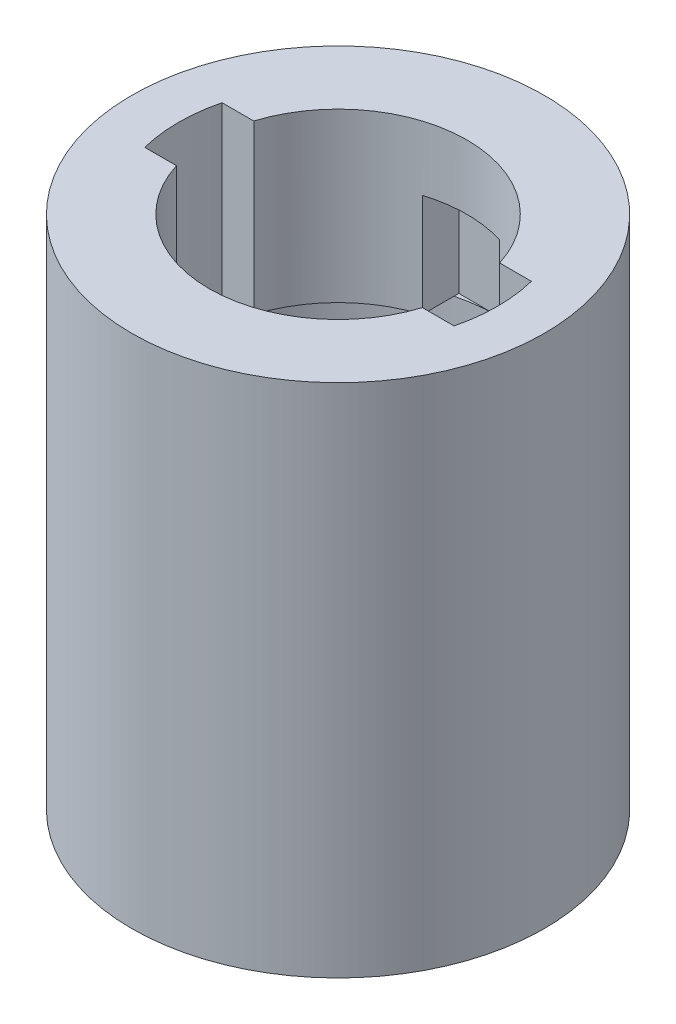
ISO-10303-21;
HEADER;
FILE_DESCRIPTION(('STEP AP214'),'2;1');
FILE_NAME('part.step','',(''),(''),'','','');
FILE_SCHEMA(('AUTOMOTIVE_DESIGN { 1 0 10303 214 1 1 1 1 }'));
ENDSEC;
DATA;
#1=APPLICATION_CONTEXT('core data for automotive mechanical design processes');
#2=APPLICATION_PROTOCOL_DEFINITION('international standard','automotive_design',2000,#1);
#3=PRODUCT_CONTEXT('',#1,'mechanical');
#4=PRODUCT('Part','Part','',(#3));
#5=PRODUCT_RELATED_PRODUCT_CATEGORY('part','',(#4));
#6=PRODUCT_DEFINITION_FORMATION('','',#4);
#7=PRODUCT_DEFINITION_CONTEXT('part definition',#1,'design');
#8=PRODUCT_DEFINITION('design','',#6,#7);
#9=PRODUCT_DEFINITION_SHAPE('','',#8);
#10=(LENGTH_UNIT() NAMED_UNIT(*) SI_UNIT(.MILLI.,.METRE.));
#11=(NAMED_UNIT(*) PLANE_ANGLE_UNIT() SI_UNIT($,.RADIAN.));
#12=(NAMED_UNIT(*) SI_UNIT($,.STERADIAN.) SOLID_ANGLE_UNIT());
#13=UNCERTAINTY_MEASURE_WITH_UNIT(LENGTH_MEASURE(1.E-05),#10,'distance_accuracy_value','');
#14=(GEOMETRIC_REPRESENTATION_CONTEXT(3) GLOBAL_UNCERTAINTY_ASSIGNED_CONTEXT((#13)) GLOBAL_UNIT_ASSIGNED_CONTEXT((#10,
#11,#12)) REPRESENTATION_CONTEXT('',''));
#15=CARTESIAN_POINT('',(0.,0.,0.));
#16=DIRECTION('',(0.,0.,1.));
#17=DIRECTION('',(1.,0.,0.));
#18=AXIS2_PLACEMENT_3D('',#15,#16,#17);
#19=CARTESIAN_POINT('',(6.,13.5,0.));
#20=DIRECTION('',(0.,1.,0.));
#21=DIRECTION('',(0.,0.,1.));
#22=AXIS2_PLACEMENT_3D('',#19,#20,#21);
#23=PLANE('',#22);
#24=CARTESIAN_POINT('',(0.,13.5,0.));
#25=DIRECTION('',(0.,1.,0.));
#26=DIRECTION('',(0.,0.,1.));
#27=AXIS2_PLACEMENT_3D('',#24,#25,#26);
#28=CIRCLE('',#27,5.);
#29=CARTESIAN_POINT('',(-4.76969600708473,13.5,1.5));
#30=VERTEX_POINT('',#29);
#31=CARTESIAN_POINT('',(-1.5,13.5,4.76969600708473));
#32=VERTEX_POINT('',#31);
#33=EDGE_CURVE('E233',#30,#32,#28,.T.);
#34=ORIENTED_EDGE('',*,*,#33,.T.);
#35=DIRECTION('',(0.,0.,-1.));
#36=VECTOR('',#35,1.);
#37=CARTESIAN_POINT('',(-1.5,13.5,-6.));
#38=LINE('',#37,#36);
#39=CARTESIAN_POINT('',(-1.5,13.5,6.));
#40=VERTEX_POINT('',#39);
#41=EDGE_CURVE('E209',#40,#32,#38,.T.);
#42=ORIENTED_EDGE('',*,*,#41,.F.);
#43=CARTESIAN_POINT('',(0.,13.5,0.));
#44=DIRECTION('',(0.,-1.,0.));
#45=DIRECTION('',(0.,0.,-1.));
#46=AXIS2_PLACEMENT_3D('',#43,#44,#45);
#47=CIRCLE('',#46,6.18465843842649);
#48=CARTESIAN_POINT('',(-6.,13.5,1.5));
#49=VERTEX_POINT('',#48);
#50=EDGE_CURVE('E230',#40,#49,#47,.T.);
#51=ORIENTED_EDGE('',*,*,#50,.T.);
#52=DIRECTION('',(-1.,0.,0.));
#53=VECTOR('',#52,1.);
#54=CARTESIAN_POINT('',(-6.,13.5,1.5));
#55=LINE('',#54,#53);
#56=EDGE_CURVE('E236',#30,#49,#55,.T.);
#57=ORIENTED_EDGE('',*,*,#56,.F.);
#58=EDGE_LOOP('',(#34,#42,#51,#57));
#59=FACE_BOUND('',#58,.T.);
#60=ADVANCED_FACE('F31',(#59),#23,.F.);
#61=CARTESIAN_POINT('',(-6.,13.5,-1.5));
#62=VERTEX_POINT('',#61);
#63=CARTESIAN_POINT('',(-1.5,13.5,-6.));
#64=VERTEX_POINT('',#63);
#65=EDGE_CURVE('E227',#62,#64,#47,.T.);
#66=ORIENTED_EDGE('',*,*,#65,.T.);
#67=DIRECTION('',(0.,0.,1.));
#68=VECTOR('',#67,1.);
#69=CARTESIAN_POINT('',(-1.5,13.5,0.));
#70=LINE('',#69,#68);
#71=CARTESIAN_POINT('',(-1.5,13.5,-4.76969600708473));
#72=VERTEX_POINT('',#71);
#73=EDGE_CURVE('E39',#64,#72,#70,.T.);
#74=ORIENTED_EDGE('',*,*,#73,.T.);
#75=CARTESIAN_POINT('',(-4.76969600708473,13.5,-1.5));
#76=VERTEX_POINT('',#75);
#77=EDGE_CURVE('E244',#72,#76,#28,.T.);
#78=ORIENTED_EDGE('',*,*,#77,.T.);
#79=DIRECTION('',(1.,0.,0.));
#80=VECTOR('',#79,1.);
#81=CARTESIAN_POINT('',(-6.,13.5,-1.5));
#82=LINE('',#81,#80);
#83=EDGE_CURVE('E245',#62,#76,#82,.T.);
#84=ORIENTED_EDGE('',*,*,#83,.F.);
#85=EDGE_LOOP('',(#66,#74,#78,#84));
#86=FACE_BOUND('',#85,.T.);
#87=ADVANCED_FACE('F305',(#86),#23,.F.);
#88=CARTESIAN_POINT('',(0.,20.,0.));
#89=DIRECTION('',(0.,-1.,0.));
#90=DIRECTION('',(0.,0.,-1.));
#91=AXIS2_PLACEMENT_3D('',#88,#89,#90);
#92=CYLINDRICAL_SURFACE('',#91,5.);
#93=DIRECTION('',(0.,-1.,0.));
#94=VECTOR('',#93,1.);
#95=CARTESIAN_POINT('',(-1.5,20.,4.76969600708473));
#96=LINE('',#95,#94);
#97=CARTESIAN_POINT('',(-1.50000000000005,17.5,4.76969600708471));
#98=VERTEX_POINT('',#97);
#99=EDGE_CURVE('E222',#32,#98,#96,.F.);
#100=ORIENTED_EDGE('',*,*,#99,.F.);
#101=ORIENTED_EDGE('',*,*,#33,.F.);
#102=DIRECTION('',(0.,-1.,0.));
#103=VECTOR('',#102,1.);
#104=CARTESIAN_POINT('',(-4.76969600708473,20.,1.5));
#105=LINE('',#104,#103);
#106=CARTESIAN_POINT('',(-4.76969600708473,20.,1.5));
#107=VERTEX_POINT('',#106);
#108=EDGE_CURVE('E287',#107,#30,#105,.T.);
#109=ORIENTED_EDGE('',*,*,#108,.F.);
#110=CARTESIAN_POINT('',(0.,20.,0.));
#111=DIRECTION('',(0.,1.,0.));
#112=DIRECTION('',(0.,0.,1.));
#113=AXIS2_PLACEMENT_3D('',#110,#111,#112);
#114=CIRCLE('',#113,5.);
#115=CARTESIAN_POINT('',(4.76969600708473,20.,1.5));
#116=VERTEX_POINT('',#115);
#117=EDGE_CURVE('E272',#107,#116,#114,.T.);
#118=ORIENTED_EDGE('',*,*,#117,.T.);
#119=DIRECTION('',(0.,-1.,0.));
#120=VECTOR('',#119,1.);
#121=CARTESIAN_POINT('',(4.76969600708473,20.,1.5));
#122=LINE('',#121,#120);
#123=CARTESIAN_POINT('',(4.76969600708473,13.5,1.5));
#124=VERTEX_POINT('',#123);
#125=EDGE_CURVE('E292',#124,#116,#122,.F.);
#126=ORIENTED_EDGE('',*,*,#125,.F.);
#127=CARTESIAN_POINT('',(1.5,13.5,4.76969600708473));
#128=VERTEX_POINT('',#127);
#129=EDGE_CURVE('E237',#128,#124,#28,.T.);
#130=ORIENTED_EDGE('',*,*,#129,.F.);
#131=DIRECTION('',(0.,-1.,0.));
#132=VECTOR('',#131,1.);
#133=CARTESIAN_POINT('',(1.5,20.,4.76969600708473));
#134=LINE('',#133,#132);
#135=CARTESIAN_POINT('',(1.49999999999995,17.5,4.76969600708475));
#136=VERTEX_POINT('',#135);
#137=EDGE_CURVE('E46',#136,#128,#134,.T.);
#138=ORIENTED_EDGE('',*,*,#137,.F.);
#139=CARTESIAN_POINT('',(0.,17.5,0.));
#140=DIRECTION('',(0.,1.,0.));
#141=DIRECTION('',(0.,0.,1.));
#142=AXIS2_PLACEMENT_3D('',#139,#140,#141);
#143=CIRCLE('',#142,5.);
#144=EDGE_CURVE('E224',#98,#136,#143,.T.);
#145=ORIENTED_EDGE('',*,*,#144,.F.);
#146=EDGE_LOOP('',(#100,#101,#109,#118,#126,#130,#138,#145));
#147=FACE_BOUND('',#146,.T.);
#148=ADVANCED_FACE('F371',(#147),#92,.F.);
#149=DIRECTION('',(0.,-1.,0.));
#150=VECTOR('',#149,1.);
#151=CARTESIAN_POINT('',(-1.5,20.,-4.76969600708473));
#152=LINE('',#151,#150);
#153=CARTESIAN_POINT('',(-1.50000000000001,17.5,-4.76969600708473));
#154=VERTEX_POINT('',#153);
#155=EDGE_CURVE('E220',#154,#72,#152,.T.);
#156=ORIENTED_EDGE('',*,*,#155,.F.);
#157=CARTESIAN_POINT('',(0.,17.5,0.));
#158=DIRECTION('',(0.,1.,0.));
#159=DIRECTION('',(0.,0.,1.));
#160=AXIS2_PLACEMENT_3D('',#157,#158,#159);
#161=CIRCLE('',#160,5.);
#162=CARTESIAN_POINT('',(1.49999999999999,17.5,-4.76969600708473));
#163=VERTEX_POINT('',#162);
#164=EDGE_CURVE('E11',#163,#154,#161,.T.);
#165=ORIENTED_EDGE('',*,*,#164,.F.);
#166=DIRECTION('',(0.,-1.,0.));
#167=VECTOR('',#166,1.);
#168=CARTESIAN_POINT('',(1.5,20.,-4.76969600708473));
#169=LINE('',#168,#167);
#170=CARTESIAN_POINT('',(1.5,13.5,-4.76969600708473));
#171=VERTEX_POINT('',#170);
#172=EDGE_CURVE('E213',#171,#163,#169,.F.);
#173=ORIENTED_EDGE('',*,*,#172,.F.);
#174=CARTESIAN_POINT('',(4.76969600708473,13.5,-1.5));
#175=VERTEX_POINT('',#174);
#176=EDGE_CURVE('E238',#175,#171,#28,.T.);
#177=ORIENTED_EDGE('',*,*,#176,.F.);
#178=DIRECTION('',(0.,-1.,0.));
#179=VECTOR('',#178,1.);
#180=CARTESIAN_POINT('',(4.76969600708473,20.,-1.5));
#181=LINE('',#180,#179);
#182=CARTESIAN_POINT('',(4.76969600708473,20.,-1.5));
#183=VERTEX_POINT('',#182);
#184=EDGE_CURVE('E294',#183,#175,#181,.T.);
#185=ORIENTED_EDGE('',*,*,#184,.F.);
#186=CARTESIAN_POINT('',(-4.76969600708473,20.,-1.5));
#187=VERTEX_POINT('',#186);
#188=EDGE_CURVE('E275',#183,#187,#114,.T.);
#189=ORIENTED_EDGE('',*,*,#188,.T.);
#190=DIRECTION('',(0.,-1.,0.));
#191=VECTOR('',#190,1.);
#192=CARTESIAN_POINT('',(-4.76969600708473,20.,-1.5));
#193=LINE('',#192,#191);
#194=EDGE_CURVE('E290',#76,#187,#193,.F.);
#195=ORIENTED_EDGE('',*,*,#194,.F.);
#196=ORIENTED_EDGE('',*,*,#77,.F.);
#197=EDGE_LOOP('',(#156,#165,#173,#177,#185,#189,#195,#196));
#198=FACE_BOUND('',#197,.T.);
#199=ADVANCED_FACE('F310',(#198),#92,.F.);
#200=CARTESIAN_POINT('',(0.,20.,0.));
#201=DIRECTION('',(0.,1.,0.));
#202=DIRECTION('',(0.,0.,1.));
#203=AXIS2_PLACEMENT_3D('',#200,#201,#202);
#204=PLANE('',#203);
#205=DIRECTION('',(-1.,0.,0.));
#206=VECTOR('',#205,1.);
#207=CARTESIAN_POINT('',(-6.,20.,-1.5));
#208=LINE('',#207,#206);
#209=CARTESIAN_POINT('',(-6.,20.,-1.5));
#210=VERTEX_POINT('',#209);
#211=EDGE_CURVE('E262',#187,#210,#208,.T.);
#212=ORIENTED_EDGE('',*,*,#211,.F.);
#213=ORIENTED_EDGE('',*,*,#188,.F.);
#214=CARTESIAN_POINT('',(6.,20.,-1.5));
#215=VERTEX_POINT('',#214);
#216=EDGE_CURVE('E253',#215,#183,#208,.T.);
#217=ORIENTED_EDGE('',*,*,#216,.F.);
#218=CARTESIAN_POINT('',(0.,20.,0.));
#219=DIRECTION('',(0.,1.,0.));
#220=DIRECTION('',(0.,0.,-1.));
#221=AXIS2_PLACEMENT_3D('',#218,#219,#220);
#222=CIRCLE('',#221,6.18465843842649);
#223=CARTESIAN_POINT('',(6.,20.,1.5));
#224=VERTEX_POINT('',#223);
#225=EDGE_CURVE('E259',#224,#215,#222,.T.);
#226=ORIENTED_EDGE('',*,*,#225,.F.);
#227=DIRECTION('',(1.,0.,0.));
#228=VECTOR('',#227,1.);
#229=CARTESIAN_POINT('',(-6.,20.,1.5));
#230=LINE('',#229,#228);
#231=EDGE_CURVE('E256',#116,#224,#230,.T.);
#232=ORIENTED_EDGE('',*,*,#231,.F.);
#233=ORIENTED_EDGE('',*,*,#117,.F.);
#234=CARTESIAN_POINT('',(-6.,20.,1.5));
#235=VERTEX_POINT('',#234);
#236=EDGE_CURVE('E257',#235,#107,#230,.T.);
#237=ORIENTED_EDGE('',*,*,#236,.F.);
#238=CARTESIAN_POINT('',(0.,20.,0.));
#239=DIRECTION('',(0.,1.,0.));
#240=DIRECTION('',(0.,0.,1.));
#241=AXIS2_PLACEMENT_3D('',#238,#239,#240);
#242=CIRCLE('',#241,6.18465843842649);
#243=EDGE_CURVE('E248',#210,#235,#242,.T.);
#244=ORIENTED_EDGE('',*,*,#243,.F.);
#245=EDGE_LOOP('',(#212,#213,#217,#226,#232,#233,#237,#244));
#246=FACE_BOUND('',#245,.T.);
#247=CARTESIAN_POINT('',(0.,20.,0.));
#248=DIRECTION('',(0.,1.,0.));
#249=DIRECTION('',(0.,0.,1.));
#250=AXIS2_PLACEMENT_3D('',#247,#248,#249);
#251=CIRCLE('',#250,8.);
#252=CARTESIAN_POINT('',(0.,20.,8.));
#253=VERTEX_POINT('',#252);
#254=EDGE_CURVE('E278',#253,#253,#251,.T.);
#255=ORIENTED_EDGE('',*,*,#254,.T.);
#256=EDGE_LOOP('',(#255));
#257=FACE_BOUND('',#256,.T.);
#258=ADVANCED_FACE('F344',(#246,#257),#204,.T.);
#259=CARTESIAN_POINT('',(0.,0.,0.));
#260=DIRECTION('',(0.,1.,0.));
#261=DIRECTION('',(0.,0.,1.));
#262=AXIS2_PLACEMENT_3D('',#259,#260,#261);
#263=PLANE('',#262);
#264=CARTESIAN_POINT('',(0.,0.,0.));
#265=DIRECTION('',(0.,1.,0.));
#266=DIRECTION('',(0.,0.,1.));
#267=AXIS2_PLACEMENT_3D('',#264,#265,#266);
#268=CIRCLE('',#267,8.);
#269=CARTESIAN_POINT('',(0.,0.,8.));
#270=VERTEX_POINT('',#269);
#271=EDGE_CURVE('E282',#270,#270,#268,.T.);
#272=ORIENTED_EDGE('',*,*,#271,.F.);
#273=EDGE_LOOP('',(#272));
#274=FACE_BOUND('',#273,.T.);
#275=CARTESIAN_POINT('',(0.,0.,0.));
#276=DIRECTION('',(0.,1.,0.));
#277=DIRECTION('',(0.,0.,1.));
#278=AXIS2_PLACEMENT_3D('',#275,#276,#277);
#279=CIRCLE('',#278,5.);
#280=CARTESIAN_POINT('',(0.,0.,5.));
#281=VERTEX_POINT('',#280);
#282=EDGE_CURVE('E266',#281,#281,#279,.T.);
#283=ORIENTED_EDGE('',*,*,#282,.T.);
#284=EDGE_LOOP('',(#283));
#285=FACE_BOUND('',#284,.T.);
#286=ADVANCED_FACE('F599',(#274,#285),#263,.F.);
#287=CARTESIAN_POINT('',(0.,20.,0.));
#288=DIRECTION('',(0.,-1.,0.));
#289=DIRECTION('',(0.,0.,-1.));
#290=AXIS2_PLACEMENT_3D('',#287,#288,#289);
#291=CYLINDRICAL_SURFACE('',#290,8.);
#292=ORIENTED_EDGE('',*,*,#254,.F.);
#293=EDGE_LOOP('',(#292));
#294=FACE_BOUND('',#293,.T.);
#295=ORIENTED_EDGE('',*,*,#271,.T.);
#296=EDGE_LOOP('',(#295));
#297=FACE_BOUND('',#296,.T.);
#298=ADVANCED_FACE('F33',(#294,#297),#291,.T.);
#299=CARTESIAN_POINT('',(0.,10.5,0.));
#300=DIRECTION('',(0.,1.,0.));
#301=DIRECTION('',(0.,0.,1.));
#302=AXIS2_PLACEMENT_3D('',#299,#300,#301);
#303=CIRCLE('',#302,5.);
#304=CARTESIAN_POINT('',(0.,10.5,5.));
#305=VERTEX_POINT('',#304);
#306=EDGE_CURVE('E281',#305,#305,#303,.T.);
#307=ORIENTED_EDGE('',*,*,#306,.T.);
#308=EDGE_LOOP('',(#307));
#309=FACE_BOUND('',#308,.T.);
#310=ORIENTED_EDGE('',*,*,#282,.F.);
#311=EDGE_LOOP('',(#310));
#312=FACE_BOUND('',#311,.T.);
#313=ADVANCED_FACE('F395',(#309,#312),#92,.F.);
#314=CARTESIAN_POINT('',(-6.,10.5,1.5));
#315=DIRECTION('',(0.,0.,1.));
#316=DIRECTION('',(1.,0.,0.));
#317=AXIS2_PLACEMENT_3D('',#314,#315,#316);
#318=PLANE('',#317);
#319=ORIENTED_EDGE('',*,*,#108,.T.);
#320=ORIENTED_EDGE('',*,*,#56,.T.);
#321=DIRECTION('',(0.,1.,0.));
#322=VECTOR('',#321,1.);
#323=CARTESIAN_POINT('',(-6.,10.5,1.5));
#324=LINE('',#323,#322);
#325=EDGE_CURVE('E252',#49,#235,#324,.T.);
#326=ORIENTED_EDGE('',*,*,#325,.T.);
#327=ORIENTED_EDGE('',*,*,#236,.T.);
#328=EDGE_LOOP('',(#319,#320,#326,#327));
#329=FACE_BOUND('',#328,.T.);
#330=ADVANCED_FACE('F386',(#329),#318,.F.);
#331=CARTESIAN_POINT('',(-6.,10.5,-1.5));
#332=DIRECTION('',(0.,0.,-1.));
#333=DIRECTION('',(-1.,0.,0.));
#334=AXIS2_PLACEMENT_3D('',#331,#332,#333);
#335=PLANE('',#334);
#336=DIRECTION('',(0.,1.,0.));
#337=VECTOR('',#336,1.);
#338=CARTESIAN_POINT('',(-6.,10.5,-1.5));
#339=LINE('',#338,#337);
#340=EDGE_CURVE('E264',#62,#210,#339,.T.);
#341=ORIENTED_EDGE('',*,*,#340,.F.);
#342=ORIENTED_EDGE('',*,*,#83,.T.);
#343=ORIENTED_EDGE('',*,*,#194,.T.);
#344=ORIENTED_EDGE('',*,*,#211,.T.);
#345=EDGE_LOOP('',(#341,#342,#343,#344));
#346=FACE_BOUND('',#345,.T.);
#347=ADVANCED_FACE('F394',(#346),#335,.F.);
#348=CARTESIAN_POINT('',(0.,10.5,0.));
#349=DIRECTION('',(0.,1.,0.));
#350=DIRECTION('',(0.,0.,1.));
#351=AXIS2_PLACEMENT_3D('',#348,#349,#350);
#352=CYLINDRICAL_SURFACE('',#351,6.18465843842649);
#353=ORIENTED_EDGE('',*,*,#325,.F.);
#354=ORIENTED_EDGE('',*,*,#50,.F.);
#355=CARTESIAN_POINT('',(0.,13.5,6.18465843842649));
#356=VERTEX_POINT('',#355);
#357=EDGE_CURVE('E318',#356,#40,#47,.T.);
#358=ORIENTED_EDGE('',*,*,#357,.F.);
#359=CARTESIAN_POINT('',(1.5,13.5,6.));
#360=VERTEX_POINT('',#359);
#361=EDGE_CURVE('E316',#360,#356,#47,.T.);
#362=ORIENTED_EDGE('',*,*,#361,.F.);
#363=CARTESIAN_POINT('',(6.,13.5,1.5));
#364=VERTEX_POINT('',#363);
#365=EDGE_CURVE('E232',#364,#360,#47,.T.);
#366=ORIENTED_EDGE('',*,*,#365,.F.);
#367=DIRECTION('',(0.,1.,0.));
#368=VECTOR('',#367,1.);
#369=CARTESIAN_POINT('',(6.,10.5,1.5));
#370=LINE('',#369,#368);
#371=EDGE_CURVE('E269',#364,#224,#370,.T.);
#372=ORIENTED_EDGE('',*,*,#371,.T.);
#373=ORIENTED_EDGE('',*,*,#225,.T.);
#374=DIRECTION('',(0.,1.,0.));
#375=VECTOR('',#374,1.);
#376=CARTESIAN_POINT('',(6.,10.5,-1.5));
#377=LINE('',#376,#375);
#378=CARTESIAN_POINT('',(6.,13.5,-1.5));
#379=VERTEX_POINT('',#378);
#380=EDGE_CURVE('E267',#379,#215,#377,.T.);
#381=ORIENTED_EDGE('',*,*,#380,.F.);
#382=CARTESIAN_POINT('',(1.5,13.5,-6.));
#383=VERTEX_POINT('',#382);
#384=EDGE_CURVE('E226',#383,#379,#47,.T.);
#385=ORIENTED_EDGE('',*,*,#384,.F.);
#386=CARTESIAN_POINT('',(0.,13.5,-6.18465843842649));
#387=VERTEX_POINT('',#386);
#388=EDGE_CURVE('E319',#387,#383,#47,.T.);
#389=ORIENTED_EDGE('',*,*,#388,.F.);
#390=EDGE_CURVE('E231',#64,#387,#47,.T.);
#391=ORIENTED_EDGE('',*,*,#390,.F.);
#392=ORIENTED_EDGE('',*,*,#65,.F.);
#393=ORIENTED_EDGE('',*,*,#340,.T.);
#394=ORIENTED_EDGE('',*,*,#243,.T.);
#395=EDGE_LOOP('',(#353,#354,#358,#362,#366,#372,#373,#381,#385,#389,#391,#392,#393,#394));
#396=FACE_BOUND('',#395,.T.);
#397=CARTESIAN_POINT('',(0.,10.5,0.));
#398=DIRECTION('',(0.,1.,0.));
#399=DIRECTION('',(0.,0.,1.));
#400=AXIS2_PLACEMENT_3D('',#397,#398,#399);
#401=CIRCLE('',#400,6.18465843842649);
#402=CARTESIAN_POINT('',(0.,10.5,6.18465843842649));
#403=VERTEX_POINT('',#402);
#404=EDGE_CURVE('E249',#403,#403,#401,.T.);
#405=ORIENTED_EDGE('',*,*,#404,.F.);
#406=EDGE_LOOP('',(#405));
#407=FACE_BOUND('',#406,.T.);
#408=ADVANCED_FACE('F334',(#396,#407),#352,.F.);
#409=ORIENTED_EDGE('',*,*,#184,.T.);
#410=DIRECTION('',(1.,0.,0.));
#411=VECTOR('',#410,1.);
#412=CARTESIAN_POINT('',(-6.,13.5,-1.5));
#413=LINE('',#412,#411);
#414=EDGE_CURVE('E241',#175,#379,#413,.T.);
#415=ORIENTED_EDGE('',*,*,#414,.T.);
#416=ORIENTED_EDGE('',*,*,#380,.T.);
#417=ORIENTED_EDGE('',*,*,#216,.T.);
#418=EDGE_LOOP('',(#409,#415,#416,#417));
#419=FACE_BOUND('',#418,.T.);
#420=ADVANCED_FACE('F331',(#419),#335,.F.);
#421=CARTESIAN_POINT('',(0.,10.5,0.));
#422=DIRECTION('',(0.,1.,0.));
#423=DIRECTION('',(0.,0.,1.));
#424=AXIS2_PLACEMENT_3D('',#421,#422,#423);
#425=PLANE('',#424);
#426=ORIENTED_EDGE('',*,*,#306,.F.);
#427=EDGE_LOOP('',(#426));
#428=FACE_BOUND('',#427,.T.);
#429=ORIENTED_EDGE('',*,*,#404,.T.);
#430=EDGE_LOOP('',(#429));
#431=FACE_BOUND('',#430,.T.);
#432=ADVANCED_FACE('F383',(#428,#431),#425,.T.);
#433=ORIENTED_EDGE('',*,*,#371,.F.);
#434=DIRECTION('',(-1.,0.,0.));
#435=VECTOR('',#434,1.);
#436=CARTESIAN_POINT('',(-6.,13.5,1.5));
#437=LINE('',#436,#435);
#438=EDGE_CURVE('E297',#364,#124,#437,.T.);
#439=ORIENTED_EDGE('',*,*,#438,.T.);
#440=ORIENTED_EDGE('',*,*,#125,.T.);
#441=ORIENTED_EDGE('',*,*,#231,.T.);
#442=EDGE_LOOP('',(#433,#439,#440,#441));
#443=FACE_BOUND('',#442,.T.);
#444=ADVANCED_FACE('F379',(#443),#318,.F.);
#445=ORIENTED_EDGE('',*,*,#365,.T.);
#446=DIRECTION('',(0.,0.,1.));
#447=VECTOR('',#446,1.);
#448=CARTESIAN_POINT('',(1.5,13.5,6.));
#449=LINE('',#448,#447);
#450=EDGE_CURVE('E203',#128,#360,#449,.T.);
#451=ORIENTED_EDGE('',*,*,#450,.F.);
#452=ORIENTED_EDGE('',*,*,#129,.T.);
#453=ORIENTED_EDGE('',*,*,#438,.F.);
#454=EDGE_LOOP('',(#445,#451,#452,#453));
#455=FACE_BOUND('',#454,.T.);
#456=ADVANCED_FACE('F372',(#455),#23,.F.);
#457=ORIENTED_EDGE('',*,*,#176,.T.);
#458=DIRECTION('',(0.,0.,-1.));
#459=VECTOR('',#458,1.);
#460=CARTESIAN_POINT('',(1.5,13.5,0.));
#461=LINE('',#460,#459);
#462=EDGE_CURVE('E300',#171,#383,#461,.T.);
#463=ORIENTED_EDGE('',*,*,#462,.T.);
#464=ORIENTED_EDGE('',*,*,#384,.T.);
#465=ORIENTED_EDGE('',*,*,#414,.F.);
#466=EDGE_LOOP('',(#457,#463,#464,#465));
#467=FACE_BOUND('',#466,.T.);
#468=ADVANCED_FACE('F326',(#467),#23,.F.);
#469=CARTESIAN_POINT('',(1.5,17.5,-6.18465843842649));
#470=DIRECTION('',(0.,0.,-1.));
#471=DIRECTION('',(-1.,0.,0.));
#472=AXIS2_PLACEMENT_3D('',#469,#470,#471);
#473=PLANE('',#472);
#474=DIRECTION('',(1.,0.,0.));
#475=VECTOR('',#474,1.);
#476=CARTESIAN_POINT('',(1.5,13.5,-6.18465843842649));
#477=LINE('',#476,#475);
#478=CARTESIAN_POINT('',(-1.5,13.5,-6.18465843842649));
#479=VERTEX_POINT('',#478);
#480=EDGE_CURVE('E197',#479,#387,#477,.T.);
#481=ORIENTED_EDGE('',*,*,#480,.T.);
#482=CARTESIAN_POINT('',(1.5,13.5,-6.18465843842649));
#483=VERTEX_POINT('',#482);
#484=EDGE_CURVE('E200',#387,#483,#477,.T.);
#485=ORIENTED_EDGE('',*,*,#484,.T.);
#486=DIRECTION('',(0.,-1.,0.));
#487=VECTOR('',#486,1.);
#488=CARTESIAN_POINT('',(1.5,17.5,-6.18465843842649));
#489=LINE('',#488,#487);
#490=CARTESIAN_POINT('',(1.5,17.5,-6.18465843842649));
#491=VERTEX_POINT('',#490);
#492=EDGE_CURVE('E184',#491,#483,#489,.T.);
#493=ORIENTED_EDGE('',*,*,#492,.F.);
#494=DIRECTION('',(1.,0.,0.));
#495=VECTOR('',#494,1.);
#496=CARTESIAN_POINT('',(1.5,17.5,-6.18465843842649));
#497=LINE('',#496,#495);
#498=CARTESIAN_POINT('',(-1.5,17.5,-6.18465843842649));
#499=VERTEX_POINT('',#498);
#500=EDGE_CURVE('E169',#499,#491,#497,.T.);
#501=ORIENTED_EDGE('',*,*,#500,.F.);
#502=DIRECTION('',(0.,-1.,0.));
#503=VECTOR('',#502,1.);
#504=CARTESIAN_POINT('',(-1.5,17.5,-6.18465843842649));
#505=LINE('',#504,#503);
#506=EDGE_CURVE('E177',#499,#479,#505,.T.);
#507=ORIENTED_EDGE('',*,*,#506,.T.);
#508=EDGE_LOOP('',(#481,#485,#493,#501,#507));
#509=FACE_BOUND('',#508,.T.);
#510=ADVANCED_FACE('F187',(#509),#473,.F.);
#511=CARTESIAN_POINT('',(-1.5,17.5,-6.));
#512=DIRECTION('',(-1.,0.,0.));
#513=DIRECTION('',(0.,0.,1.));
#514=AXIS2_PLACEMENT_3D('',#511,#512,#513);
#515=PLANE('',#514);
#516=ORIENTED_EDGE('',*,*,#155,.T.);
#517=ORIENTED_EDGE('',*,*,#73,.F.);
#518=EDGE_CURVE('E180',#64,#479,#38,.T.);
#519=ORIENTED_EDGE('',*,*,#518,.T.);
#520=ORIENTED_EDGE('',*,*,#506,.F.);
#521=DIRECTION('',(0.,0.,-1.));
#522=VECTOR('',#521,1.);
#523=CARTESIAN_POINT('',(-1.5,17.5,-6.));
#524=LINE('',#523,#522);
#525=EDGE_CURVE('E164',#154,#499,#524,.T.);
#526=ORIENTED_EDGE('',*,*,#525,.F.);
#527=EDGE_LOOP('',(#516,#517,#519,#520,#526));
#528=FACE_BOUND('',#527,.T.);
#529=ADVANCED_FACE('F178',(#528),#515,.F.);
#530=CARTESIAN_POINT('',(-1.5,13.5,-6.18465843842649));
#531=DIRECTION('',(0.,1.,0.));
#532=DIRECTION('',(0.,0.,1.));
#533=AXIS2_PLACEMENT_3D('',#530,#531,#532);
#534=PLANE('',#533);
#535=ORIENTED_EDGE('',*,*,#390,.T.);
#536=ORIENTED_EDGE('',*,*,#480,.F.);
#537=ORIENTED_EDGE('',*,*,#518,.F.);
#538=EDGE_LOOP('',(#535,#536,#537));
#539=FACE_BOUND('',#538,.T.);
#540=ADVANCED_FACE('F350',(#539),#534,.T.);
#541=CARTESIAN_POINT('',(1.5,17.5,6.));
#542=DIRECTION('',(1.,0.,0.));
#543=DIRECTION('',(0.,0.,-1.));
#544=AXIS2_PLACEMENT_3D('',#541,#542,#543);
#545=PLANE('',#544);
#546=ORIENTED_EDGE('',*,*,#172,.T.);
#547=DIRECTION('',(0.,0.,1.));
#548=VECTOR('',#547,1.);
#549=CARTESIAN_POINT('',(1.5,17.5,-6.18465843842649));
#550=LINE('',#549,#548);
#551=EDGE_CURVE('E191',#491,#163,#550,.T.);
#552=ORIENTED_EDGE('',*,*,#551,.F.);
#553=ORIENTED_EDGE('',*,*,#492,.T.);
#554=EDGE_CURVE('E54',#483,#383,#449,.T.);
#555=ORIENTED_EDGE('',*,*,#554,.T.);
#556=ORIENTED_EDGE('',*,*,#462,.F.);
#557=EDGE_LOOP('',(#546,#552,#553,#555,#556));
#558=FACE_BOUND('',#557,.T.);
#559=ADVANCED_FACE('F347',(#558),#545,.F.);
#560=ORIENTED_EDGE('',*,*,#388,.T.);
#561=ORIENTED_EDGE('',*,*,#554,.F.);
#562=ORIENTED_EDGE('',*,*,#484,.F.);
#563=EDGE_LOOP('',(#560,#561,#562));
#564=FACE_BOUND('',#563,.T.);
#565=ADVANCED_FACE('F349',(#564),#534,.T.);
#566=CARTESIAN_POINT('',(-1.5,17.5,-6.18465843842649));
#567=DIRECTION('',(0.,1.,0.));
#568=DIRECTION('',(0.,0.,1.));
#569=AXIS2_PLACEMENT_3D('',#566,#567,#568);
#570=PLANE('',#569);
#571=ORIENTED_EDGE('',*,*,#164,.T.);
#572=ORIENTED_EDGE('',*,*,#525,.T.);
#573=ORIENTED_EDGE('',*,*,#500,.T.);
#574=ORIENTED_EDGE('',*,*,#551,.T.);
#575=EDGE_LOOP('',(#571,#572,#573,#574));
#576=FACE_BOUND('',#575,.T.);
#577=ADVANCED_FACE('F166',(#576),#570,.F.);
#578=ORIENTED_EDGE('',*,*,#144,.T.);
#579=CARTESIAN_POINT('',(1.5,17.5,6.18465843842649));
#580=VERTEX_POINT('',#579);
#581=EDGE_CURVE('E189',#136,#580,#550,.T.);
#582=ORIENTED_EDGE('',*,*,#581,.T.);
#583=DIRECTION('',(-1.,0.,0.));
#584=VECTOR('',#583,1.);
#585=CARTESIAN_POINT('',(-1.5,17.5,6.18465843842649));
#586=LINE('',#585,#584);
#587=CARTESIAN_POINT('',(-1.5,17.5,6.18465843842649));
#588=VERTEX_POINT('',#587);
#589=EDGE_CURVE('E185',#580,#588,#586,.T.);
#590=ORIENTED_EDGE('',*,*,#589,.T.);
#591=EDGE_CURVE('E173',#588,#98,#524,.T.);
#592=ORIENTED_EDGE('',*,*,#591,.T.);
#593=EDGE_LOOP('',(#578,#582,#590,#592));
#594=FACE_BOUND('',#593,.T.);
#595=ADVANCED_FACE('F414',(#594),#570,.F.);
#596=ORIENTED_EDGE('',*,*,#357,.T.);
#597=CARTESIAN_POINT('',(-1.5,13.5,6.18465843842649));
#598=VERTEX_POINT('',#597);
#599=EDGE_CURVE('E174',#598,#40,#38,.T.);
#600=ORIENTED_EDGE('',*,*,#599,.F.);
#601=DIRECTION('',(-1.,0.,0.));
#602=VECTOR('',#601,1.);
#603=CARTESIAN_POINT('',(-1.5,13.5,6.18465843842649));
#604=LINE('',#603,#602);
#605=EDGE_CURVE('E202',#356,#598,#604,.T.);
#606=ORIENTED_EDGE('',*,*,#605,.F.);
#607=EDGE_LOOP('',(#596,#600,#606));
#608=FACE_BOUND('',#607,.T.);
#609=ADVANCED_FACE('F358',(#608),#534,.T.);
#610=ORIENTED_EDGE('',*,*,#361,.T.);
#611=CARTESIAN_POINT('',(1.5,13.5,6.18465843842649));
#612=VERTEX_POINT('',#611);
#613=EDGE_CURVE('E204',#612,#356,#604,.T.);
#614=ORIENTED_EDGE('',*,*,#613,.F.);
#615=EDGE_CURVE('E199',#360,#612,#449,.T.);
#616=ORIENTED_EDGE('',*,*,#615,.F.);
#617=EDGE_LOOP('',(#610,#614,#616));
#618=FACE_BOUND('',#617,.T.);
#619=ADVANCED_FACE('F359',(#618),#534,.T.);
#620=ORIENTED_EDGE('',*,*,#99,.T.);
#621=ORIENTED_EDGE('',*,*,#591,.F.);
#622=DIRECTION('',(0.,-1.,0.));
#623=VECTOR('',#622,1.);
#624=CARTESIAN_POINT('',(-1.5,17.5,6.18465843842649));
#625=LINE('',#624,#623);
#626=EDGE_CURVE('E210',#588,#598,#625,.T.);
#627=ORIENTED_EDGE('',*,*,#626,.T.);
#628=ORIENTED_EDGE('',*,*,#599,.T.);
#629=ORIENTED_EDGE('',*,*,#41,.T.);
#630=EDGE_LOOP('',(#620,#621,#627,#628,#629));
#631=FACE_BOUND('',#630,.T.);
#632=ADVANCED_FACE('F364',(#631),#515,.F.);
#633=ORIENTED_EDGE('',*,*,#137,.T.);
#634=ORIENTED_EDGE('',*,*,#450,.T.);
#635=ORIENTED_EDGE('',*,*,#615,.T.);
#636=DIRECTION('',(0.,-1.,0.));
#637=VECTOR('',#636,1.);
#638=CARTESIAN_POINT('',(1.5,17.5,6.18465843842649));
#639=LINE('',#638,#637);
#640=EDGE_CURVE('E214',#580,#612,#639,.T.);
#641=ORIENTED_EDGE('',*,*,#640,.F.);
#642=ORIENTED_EDGE('',*,*,#581,.F.);
#643=EDGE_LOOP('',(#633,#634,#635,#641,#642));
#644=FACE_BOUND('',#643,.T.);
#645=ADVANCED_FACE('F352',(#644),#545,.F.);
#646=CARTESIAN_POINT('',(-1.5,17.5,6.18465843842649));
#647=DIRECTION('',(0.,0.,1.));
#648=DIRECTION('',(1.,0.,0.));
#649=AXIS2_PLACEMENT_3D('',#646,#647,#648);
#650=PLANE('',#649);
#651=ORIENTED_EDGE('',*,*,#613,.T.);
#652=ORIENTED_EDGE('',*,*,#605,.T.);
#653=ORIENTED_EDGE('',*,*,#626,.F.);
#654=ORIENTED_EDGE('',*,*,#589,.F.);
#655=ORIENTED_EDGE('',*,*,#640,.T.);
#656=EDGE_LOOP('',(#651,#652,#653,#654,#655));
#657=FACE_BOUND('',#656,.T.);
#658=ADVANCED_FACE('F363',(#657),#650,.F.);
#659=CLOSED_SHELL('',(#60,#87,#148,#199,#258,#286,#298,#313,#330,#347,#408,#420,#432,#444,#456,
#468,#510,#529,#540,#559,#565,#577,#595,#609,#619,#632,#645,#658));
#660=MANIFOLD_SOLID_BREP('B2',#659);
#661=ADVANCED_BREP_SHAPE_REPRESENTATION('',(#18,#660),#14);
#662=SHAPE_DEFINITION_REPRESENTATION(#9,#661);
ENDSEC;
END-ISO-10303-21;
